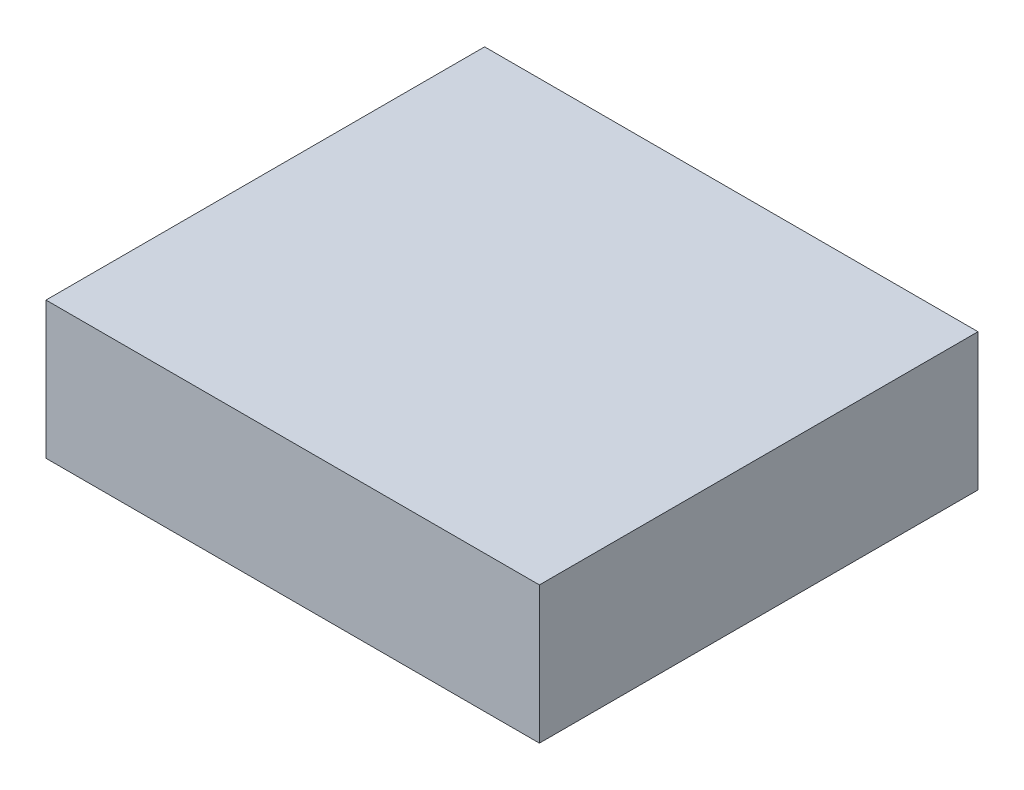
ISO-10303-21;
HEADER;
FILE_DESCRIPTION(('STEP AP214'),'2;1');
FILE_NAME('part.step','',(''),(''),'','','');
FILE_SCHEMA(('AUTOMOTIVE_DESIGN { 1 0 10303 214 1 1 1 1 }'));
ENDSEC;
DATA;
#1=APPLICATION_CONTEXT('core data for automotive mechanical design processes');
#2=APPLICATION_PROTOCOL_DEFINITION('international standard','automotive_design',2000,#1);
#3=PRODUCT_CONTEXT('',#1,'mechanical');
#4=PRODUCT('Part','Part','',(#3));
#5=PRODUCT_RELATED_PRODUCT_CATEGORY('part','',(#4));
#6=PRODUCT_DEFINITION_FORMATION('','',#4);
#7=PRODUCT_DEFINITION_CONTEXT('part definition',#1,'design');
#8=PRODUCT_DEFINITION('design','',#6,#7);
#9=PRODUCT_DEFINITION_SHAPE('','',#8);
#10=(LENGTH_UNIT() NAMED_UNIT(*) SI_UNIT(.MILLI.,.METRE.));
#11=(NAMED_UNIT(*) PLANE_ANGLE_UNIT() SI_UNIT($,.RADIAN.));
#12=(NAMED_UNIT(*) SI_UNIT($,.STERADIAN.) SOLID_ANGLE_UNIT());
#13=UNCERTAINTY_MEASURE_WITH_UNIT(LENGTH_MEASURE(1.E-05),#10,'distance_accuracy_value','');
#14=(GEOMETRIC_REPRESENTATION_CONTEXT(3) GLOBAL_UNCERTAINTY_ASSIGNED_CONTEXT((#13)) GLOBAL_UNIT_ASSIGNED_CONTEXT((#10,
#11,#12)) REPRESENTATION_CONTEXT('',''));
#15=CARTESIAN_POINT('',(0.,0.,0.));
#16=DIRECTION('',(0.,0.,1.));
#17=DIRECTION('',(1.,0.,0.));
#18=AXIS2_PLACEMENT_3D('',#15,#16,#17);
#19=CARTESIAN_POINT('',(9.,5.,-8.));
#20=DIRECTION('',(-1.,0.,0.));
#21=DIRECTION('',(0.,0.,1.));
#22=AXIS2_PLACEMENT_3D('',#19,#20,#21);
#23=PLANE('',#22);
#24=DIRECTION('',(0.,0.,-1.));
#25=VECTOR('',#24,1.);
#26=CARTESIAN_POINT('',(9.,0.,-8.));
#27=LINE('',#26,#25);
#28=CARTESIAN_POINT('',(9.,0.,8.));
#29=VERTEX_POINT('',#28);
#30=CARTESIAN_POINT('',(9.,0.,-8.));
#31=VERTEX_POINT('',#30);
#32=EDGE_CURVE('E101',#29,#31,#27,.T.);
#33=ORIENTED_EDGE('',*,*,#32,.T.);
#34=DIRECTION('',(0.,-1.,0.));
#35=VECTOR('',#34,1.);
#36=CARTESIAN_POINT('',(9.,5.,-8.));
#37=LINE('',#36,#35);
#38=CARTESIAN_POINT('',(9.,5.,-8.));
#39=VERTEX_POINT('',#38);
#40=EDGE_CURVE('E11',#39,#31,#37,.T.);
#41=ORIENTED_EDGE('',*,*,#40,.F.);
#42=DIRECTION('',(0.,0.,-1.));
#43=VECTOR('',#42,1.);
#44=CARTESIAN_POINT('',(9.,5.,-8.));
#45=LINE('',#44,#43);
#46=CARTESIAN_POINT('',(9.,5.,8.));
#47=VERTEX_POINT('',#46);
#48=EDGE_CURVE('E95',#47,#39,#45,.T.);
#49=ORIENTED_EDGE('',*,*,#48,.F.);
#50=DIRECTION('',(0.,-1.,0.));
#51=VECTOR('',#50,1.);
#52=CARTESIAN_POINT('',(9.,5.,8.));
#53=LINE('',#52,#51);
#54=EDGE_CURVE('E99',#47,#29,#53,.T.);
#55=ORIENTED_EDGE('',*,*,#54,.T.);
#56=EDGE_LOOP('',(#33,#41,#49,#55));
#57=FACE_BOUND('',#56,.T.);
#58=ADVANCED_FACE('F41',(#57),#23,.F.);
#59=CARTESIAN_POINT('',(-9.,5.,-8.));
#60=DIRECTION('',(0.,0.,1.));
#61=DIRECTION('',(1.,0.,0.));
#62=AXIS2_PLACEMENT_3D('',#59,#60,#61);
#63=PLANE('',#62);
#64=DIRECTION('',(-1.,0.,0.));
#65=VECTOR('',#64,1.);
#66=CARTESIAN_POINT('',(-9.,0.,-8.));
#67=LINE('',#66,#65);
#68=CARTESIAN_POINT('',(-9.,0.,-8.));
#69=VERTEX_POINT('',#68);
#70=EDGE_CURVE('E96',#31,#69,#67,.T.);
#71=ORIENTED_EDGE('',*,*,#70,.T.);
#72=DIRECTION('',(0.,-1.,0.));
#73=VECTOR('',#72,1.);
#74=CARTESIAN_POINT('',(-9.,5.,-8.));
#75=LINE('',#74,#73);
#76=CARTESIAN_POINT('',(-9.,5.,-8.));
#77=VERTEX_POINT('',#76);
#78=EDGE_CURVE('E47',#77,#69,#75,.T.);
#79=ORIENTED_EDGE('',*,*,#78,.F.);
#80=DIRECTION('',(-1.,0.,0.));
#81=VECTOR('',#80,1.);
#82=CARTESIAN_POINT('',(-9.,5.,-8.));
#83=LINE('',#82,#81);
#84=EDGE_CURVE('E90',#39,#77,#83,.T.);
#85=ORIENTED_EDGE('',*,*,#84,.F.);
#86=ORIENTED_EDGE('',*,*,#40,.T.);
#87=EDGE_LOOP('',(#71,#79,#85,#86));
#88=FACE_BOUND('',#87,.T.);
#89=ADVANCED_FACE('F94',(#88),#63,.F.);
#90=CARTESIAN_POINT('',(-9.,5.,-8.));
#91=DIRECTION('',(1.,0.,0.));
#92=DIRECTION('',(0.,0.,-1.));
#93=AXIS2_PLACEMENT_3D('',#90,#91,#92);
#94=PLANE('',#93);
#95=DIRECTION('',(0.,0.,1.));
#96=VECTOR('',#95,1.);
#97=CARTESIAN_POINT('',(-9.,0.,-8.));
#98=LINE('',#97,#96);
#99=CARTESIAN_POINT('',(-9.,0.,8.));
#100=VERTEX_POINT('',#99);
#101=EDGE_CURVE('E72',#69,#100,#98,.T.);
#102=ORIENTED_EDGE('',*,*,#101,.T.);
#103=DIRECTION('',(0.,-1.,0.));
#104=VECTOR('',#103,1.);
#105=CARTESIAN_POINT('',(-9.,5.,8.));
#106=LINE('',#105,#104);
#107=CARTESIAN_POINT('',(-9.,5.,8.));
#108=VERTEX_POINT('',#107);
#109=EDGE_CURVE('E100',#108,#100,#106,.T.);
#110=ORIENTED_EDGE('',*,*,#109,.F.);
#111=DIRECTION('',(0.,0.,1.));
#112=VECTOR('',#111,1.);
#113=CARTESIAN_POINT('',(-9.,5.,-8.));
#114=LINE('',#113,#112);
#115=EDGE_CURVE('E89',#77,#108,#114,.T.);
#116=ORIENTED_EDGE('',*,*,#115,.F.);
#117=ORIENTED_EDGE('',*,*,#78,.T.);
#118=EDGE_LOOP('',(#102,#110,#116,#117));
#119=FACE_BOUND('',#118,.T.);
#120=ADVANCED_FACE('F97',(#119),#94,.F.);
#121=CARTESIAN_POINT('',(-9.,5.,8.));
#122=DIRECTION('',(0.,0.,-1.));
#123=DIRECTION('',(-1.,0.,0.));
#124=AXIS2_PLACEMENT_3D('',#121,#122,#123);
#125=PLANE('',#124);
#126=DIRECTION('',(1.,0.,0.));
#127=VECTOR('',#126,1.);
#128=CARTESIAN_POINT('',(-9.,0.,8.));
#129=LINE('',#128,#127);
#130=EDGE_CURVE('E79',#100,#29,#129,.T.);
#131=ORIENTED_EDGE('',*,*,#130,.T.);
#132=ORIENTED_EDGE('',*,*,#54,.F.);
#133=DIRECTION('',(1.,0.,0.));
#134=VECTOR('',#133,1.);
#135=CARTESIAN_POINT('',(-9.,5.,8.));
#136=LINE('',#135,#134);
#137=EDGE_CURVE('E60',#108,#47,#136,.T.);
#138=ORIENTED_EDGE('',*,*,#137,.F.);
#139=ORIENTED_EDGE('',*,*,#109,.T.);
#140=EDGE_LOOP('',(#131,#132,#138,#139));
#141=FACE_BOUND('',#140,.T.);
#142=ADVANCED_FACE('F112',(#141),#125,.F.);
#143=CARTESIAN_POINT('',(0.,5.,0.));
#144=DIRECTION('',(0.,1.,0.));
#145=DIRECTION('',(0.,0.,1.));
#146=AXIS2_PLACEMENT_3D('',#143,#144,#145);
#147=PLANE('',#146);
#148=ORIENTED_EDGE('',*,*,#48,.T.);
#149=ORIENTED_EDGE('',*,*,#84,.T.);
#150=ORIENTED_EDGE('',*,*,#115,.T.);
#151=ORIENTED_EDGE('',*,*,#137,.T.);
#152=EDGE_LOOP('',(#148,#149,#150,#151));
#153=FACE_BOUND('',#152,.T.);
#154=ADVANCED_FACE('F88',(#153),#147,.T.);
#155=CARTESIAN_POINT('',(0.,0.,0.));
#156=DIRECTION('',(0.,1.,0.));
#157=DIRECTION('',(0.,0.,1.));
#158=AXIS2_PLACEMENT_3D('',#155,#156,#157);
#159=PLANE('',#158);
#160=ORIENTED_EDGE('',*,*,#32,.F.);
#161=ORIENTED_EDGE('',*,*,#130,.F.);
#162=ORIENTED_EDGE('',*,*,#101,.F.);
#163=ORIENTED_EDGE('',*,*,#70,.F.);
#164=EDGE_LOOP('',(#160,#161,#162,#163));
#165=FACE_BOUND('',#164,.T.);
#166=ADVANCED_FACE('F114',(#165),#159,.F.);
#167=CLOSED_SHELL('',(#58,#89,#120,#142,#154,#166));
#168=MANIFOLD_SOLID_BREP('B2',#167);
#169=ADVANCED_BREP_SHAPE_REPRESENTATION('',(#18,#168),#14);
#170=SHAPE_DEFINITION_REPRESENTATION(#9,#169);
ENDSEC;
END-ISO-10303-21;
